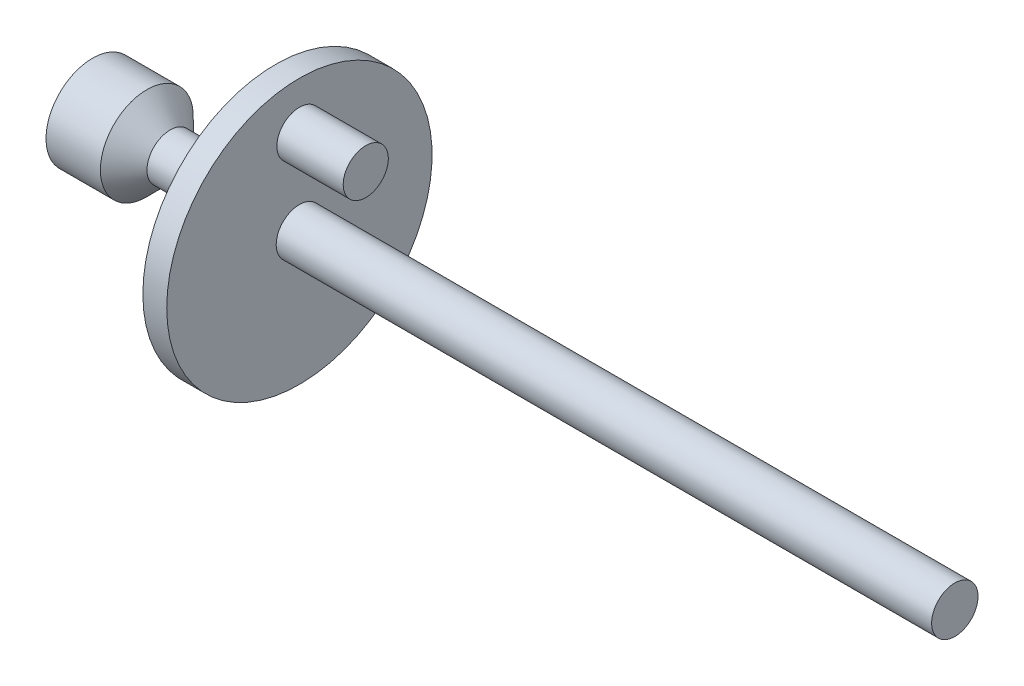
ISO-10303-21;
HEADER;
FILE_DESCRIPTION(('STEP AP214'),'2;1');
FILE_NAME('part.step','',(''),(''),'','','');
FILE_SCHEMA(('AUTOMOTIVE_DESIGN { 1 0 10303 214 1 1 1 1 }'));
ENDSEC;
DATA;
#1=APPLICATION_CONTEXT('core data for automotive mechanical design processes');
#2=APPLICATION_PROTOCOL_DEFINITION('international standard','automotive_design',2000,#1);
#3=PRODUCT_CONTEXT('',#1,'mechanical');
#4=PRODUCT('Part','Part','',(#3));
#5=PRODUCT_RELATED_PRODUCT_CATEGORY('part','',(#4));
#6=PRODUCT_DEFINITION_FORMATION('','',#4);
#7=PRODUCT_DEFINITION_CONTEXT('part definition',#1,'design');
#8=PRODUCT_DEFINITION('design','',#6,#7);
#9=PRODUCT_DEFINITION_SHAPE('','',#8);
#10=(LENGTH_UNIT() NAMED_UNIT(*) SI_UNIT(.MILLI.,.METRE.));
#11=(NAMED_UNIT(*) PLANE_ANGLE_UNIT() SI_UNIT($,.RADIAN.));
#12=(NAMED_UNIT(*) SI_UNIT($,.STERADIAN.) SOLID_ANGLE_UNIT());
#13=UNCERTAINTY_MEASURE_WITH_UNIT(LENGTH_MEASURE(1.E-05),#10,'distance_accuracy_value','');
#14=(GEOMETRIC_REPRESENTATION_CONTEXT(3) GLOBAL_UNCERTAINTY_ASSIGNED_CONTEXT((#13)) GLOBAL_UNIT_ASSIGNED_CONTEXT((#10,
#11,#12)) REPRESENTATION_CONTEXT('',''));
#15=CARTESIAN_POINT('',(0.,0.,0.));
#16=DIRECTION('',(0.,0.,1.));
#17=DIRECTION('',(1.,0.,0.));
#18=AXIS2_PLACEMENT_3D('',#15,#16,#17);
#19=CARTESIAN_POINT('',(650.,0.,0.));
#20=DIRECTION('',(-1.,0.,0.));
#21=DIRECTION('',(0.,0.,1.));
#22=AXIS2_PLACEMENT_3D('',#19,#20,#21);
#23=PLANE('',#22);
#24=CARTESIAN_POINT('',(650.,0.,0.));
#25=DIRECTION('',(-1.,0.,0.));
#26=DIRECTION('',(0.,0.,1.));
#27=AXIS2_PLACEMENT_3D('',#24,#25,#26);
#28=CIRCLE('',#27,17.5);
#29=CARTESIAN_POINT('',(650.,0.,17.5));
#30=VERTEX_POINT('',#29);
#31=EDGE_CURVE('E46',#30,#30,#28,.T.);
#32=ORIENTED_EDGE('',*,*,#31,.F.);
#33=EDGE_LOOP('',(#32));
#34=FACE_BOUND('',#33,.T.);
#35=ADVANCED_FACE('F39',(#34),#23,.F.);
#36=CARTESIAN_POINT('',(0.,0.,0.));
#37=DIRECTION('',(-1.,0.,0.));
#38=DIRECTION('',(0.,0.,1.));
#39=AXIS2_PLACEMENT_3D('',#36,#37,#38);
#40=CYLINDRICAL_SURFACE('',#39,17.5);
#41=CARTESIAN_POINT('',(156.,0.,0.));
#42=DIRECTION('',(-1.,0.,0.));
#43=DIRECTION('',(0.,0.,1.));
#44=AXIS2_PLACEMENT_3D('',#41,#42,#43);
#45=CIRCLE('',#44,17.4999999999999);
#46=CARTESIAN_POINT('',(156.,0.,17.4999999999999));
#47=VERTEX_POINT('',#46);
#48=EDGE_CURVE('E133',#47,#47,#45,.T.);
#49=ORIENTED_EDGE('',*,*,#48,.F.);
#50=EDGE_LOOP('',(#49));
#51=FACE_BOUND('',#50,.T.);
#52=ORIENTED_EDGE('',*,*,#31,.T.);
#53=EDGE_LOOP('',(#52));
#54=FACE_BOUND('',#53,.T.);
#55=ADVANCED_FACE('F138',(#51,#54),#40,.T.);
#56=CARTESIAN_POINT('',(156.,17.4999999999999,0.));
#57=DIRECTION('',(-1.,0.,0.));
#58=DIRECTION('',(0.,0.,1.));
#59=AXIS2_PLACEMENT_3D('',#56,#57,#58);
#60=PLANE('',#59);
#61=CARTESIAN_POINT('',(156.,64.,0.));
#62=DIRECTION('',(-1.,0.,0.));
#63=DIRECTION('',(0.,0.,1.));
#64=AXIS2_PLACEMENT_3D('',#61,#62,#63);
#65=CIRCLE('',#64,17.);
#66=CARTESIAN_POINT('',(156.,64.,17.));
#67=VERTEX_POINT('',#66);
#68=EDGE_CURVE('E11',#67,#67,#65,.F.);
#69=ORIENTED_EDGE('',*,*,#68,.F.);
#70=EDGE_LOOP('',(#69));
#71=FACE_BOUND('',#70,.T.);
#72=CARTESIAN_POINT('',(156.,0.,0.));
#73=DIRECTION('',(-1.,0.,0.));
#74=DIRECTION('',(0.,0.,1.));
#75=AXIS2_PLACEMENT_3D('',#72,#73,#74);
#76=CIRCLE('',#75,100.);
#77=CARTESIAN_POINT('',(156.,0.,100.));
#78=VERTEX_POINT('',#77);
#79=EDGE_CURVE('E130',#78,#78,#76,.T.);
#80=ORIENTED_EDGE('',*,*,#79,.F.);
#81=EDGE_LOOP('',(#80));
#82=FACE_BOUND('',#81,.T.);
#83=ORIENTED_EDGE('',*,*,#48,.T.);
#84=EDGE_LOOP('',(#83));
#85=FACE_BOUND('',#84,.T.);
#86=ADVANCED_FACE('F144',(#71,#82,#85),#60,.F.);
#87=CARTESIAN_POINT('',(0.,0.,0.));
#88=DIRECTION('',(-1.,0.,0.));
#89=DIRECTION('',(0.,0.,1.));
#90=AXIS2_PLACEMENT_3D('',#87,#88,#89);
#91=CYLINDRICAL_SURFACE('',#90,100.);
#92=CARTESIAN_POINT('',(138.,0.,0.));
#93=DIRECTION('',(-1.,0.,0.));
#94=DIRECTION('',(0.,0.,1.));
#95=AXIS2_PLACEMENT_3D('',#92,#93,#94);
#96=CIRCLE('',#95,100.);
#97=CARTESIAN_POINT('',(138.,0.,100.));
#98=VERTEX_POINT('',#97);
#99=EDGE_CURVE('E127',#98,#98,#96,.T.);
#100=ORIENTED_EDGE('',*,*,#99,.F.);
#101=EDGE_LOOP('',(#100));
#102=FACE_BOUND('',#101,.T.);
#103=ORIENTED_EDGE('',*,*,#79,.T.);
#104=EDGE_LOOP('',(#103));
#105=FACE_BOUND('',#104,.T.);
#106=ADVANCED_FACE('F150',(#102,#105),#91,.T.);
#107=CARTESIAN_POINT('',(138.,100.,0.));
#108=DIRECTION('',(1.,0.,0.));
#109=DIRECTION('',(0.,0.,-1.));
#110=AXIS2_PLACEMENT_3D('',#107,#108,#109);
#111=PLANE('',#110);
#112=CARTESIAN_POINT('',(138.,0.,0.));
#113=DIRECTION('',(-1.,0.,0.));
#114=DIRECTION('',(0.,0.,1.));
#115=AXIS2_PLACEMENT_3D('',#112,#113,#114);
#116=CIRCLE('',#115,17.4999999999999);
#117=CARTESIAN_POINT('',(138.,0.,17.4999999999999));
#118=VERTEX_POINT('',#117);
#119=EDGE_CURVE('E124',#118,#118,#116,.T.);
#120=ORIENTED_EDGE('',*,*,#119,.F.);
#121=EDGE_LOOP('',(#120));
#122=FACE_BOUND('',#121,.T.);
#123=ORIENTED_EDGE('',*,*,#99,.T.);
#124=EDGE_LOOP('',(#123));
#125=FACE_BOUND('',#124,.T.);
#126=ADVANCED_FACE('F157',(#122,#125),#111,.F.);
#127=CARTESIAN_POINT('',(0.,0.,0.));
#128=DIRECTION('',(-1.,0.,0.));
#129=DIRECTION('',(0.,0.,1.));
#130=AXIS2_PLACEMENT_3D('',#127,#128,#129);
#131=CYLINDRICAL_SURFACE('',#130,17.4999999999999);
#132=CARTESIAN_POINT('',(58.6,0.,0.));
#133=DIRECTION('',(-1.,0.,0.));
#134=DIRECTION('',(0.,0.,1.));
#135=AXIS2_PLACEMENT_3D('',#132,#133,#134);
#136=CIRCLE('',#135,17.4999999999999);
#137=CARTESIAN_POINT('',(58.6,0.,17.4999999999999));
#138=VERTEX_POINT('',#137);
#139=EDGE_CURVE('E121',#138,#138,#136,.T.);
#140=ORIENTED_EDGE('',*,*,#139,.F.);
#141=EDGE_LOOP('',(#140));
#142=FACE_BOUND('',#141,.T.);
#143=ORIENTED_EDGE('',*,*,#119,.T.);
#144=EDGE_LOOP('',(#143));
#145=FACE_BOUND('',#144,.T.);
#146=ADVANCED_FACE('F161',(#142,#145),#131,.T.);
#147=CARTESIAN_POINT('',(58.6,0.,0.));
#148=DIRECTION('',(-1.,0.,0.));
#149=DIRECTION('',(0.,0.,1.));
#150=AXIS2_PLACEMENT_3D('',#147,#148,#149);
#151=CONICAL_SURFACE('',#150,17.4999999999999,0.782549168256689);
#152=CARTESIAN_POINT('',(41.,0.,0.));
#153=DIRECTION('',(-1.,0.,0.));
#154=DIRECTION('',(0.,0.,1.));
#155=AXIS2_PLACEMENT_3D('',#152,#153,#154);
#156=CIRCLE('',#155,35.);
#157=CARTESIAN_POINT('',(41.,0.,35.));
#158=VERTEX_POINT('',#157);
#159=EDGE_CURVE('E118',#158,#158,#156,.T.);
#160=ORIENTED_EDGE('',*,*,#159,.F.);
#161=EDGE_LOOP('',(#160));
#162=FACE_BOUND('',#161,.T.);
#163=ORIENTED_EDGE('',*,*,#139,.T.);
#164=EDGE_LOOP('',(#163));
#165=FACE_BOUND('',#164,.T.);
#166=ADVANCED_FACE('F165',(#162,#165),#151,.T.);
#167=CARTESIAN_POINT('',(0.,0.,0.));
#168=DIRECTION('',(-1.,0.,0.));
#169=DIRECTION('',(0.,0.,1.));
#170=AXIS2_PLACEMENT_3D('',#167,#168,#169);
#171=CYLINDRICAL_SURFACE('',#170,35.);
#172=CARTESIAN_POINT('',(0.,0.,0.));
#173=DIRECTION('',(-1.,0.,0.));
#174=DIRECTION('',(0.,0.,1.));
#175=AXIS2_PLACEMENT_3D('',#172,#173,#174);
#176=CIRCLE('',#175,35.);
#177=CARTESIAN_POINT('',(0.,0.,35.));
#178=VERTEX_POINT('',#177);
#179=EDGE_CURVE('E115',#178,#178,#176,.T.);
#180=ORIENTED_EDGE('',*,*,#179,.F.);
#181=EDGE_LOOP('',(#180));
#182=FACE_BOUND('',#181,.T.);
#183=ORIENTED_EDGE('',*,*,#159,.T.);
#184=EDGE_LOOP('',(#183));
#185=FACE_BOUND('',#184,.T.);
#186=ADVANCED_FACE('F169',(#182,#185),#171,.T.);
#187=CARTESIAN_POINT('',(0.,35.,0.));
#188=DIRECTION('',(1.,0.,0.));
#189=DIRECTION('',(0.,0.,-1.));
#190=AXIS2_PLACEMENT_3D('',#187,#188,#189);
#191=PLANE('',#190);
#192=DIRECTION('',(0.,0.,1.));
#193=VECTOR('',#192,1.);
#194=CARTESIAN_POINT('',(0.,-20.,-20.));
#195=LINE('',#194,#193);
#196=CARTESIAN_POINT('',(0.,-20.,-20.));
#197=VERTEX_POINT('',#196);
#198=CARTESIAN_POINT('',(0.,-20.,20.));
#199=VERTEX_POINT('',#198);
#200=EDGE_CURVE('E97',#197,#199,#195,.T.);
#201=ORIENTED_EDGE('',*,*,#200,.F.);
#202=DIRECTION('',(0.,-1.,0.));
#203=VECTOR('',#202,1.);
#204=CARTESIAN_POINT('',(0.,20.,-20.));
#205=LINE('',#204,#203);
#206=CARTESIAN_POINT('',(0.,20.,-20.));
#207=VERTEX_POINT('',#206);
#208=EDGE_CURVE('E53',#207,#197,#205,.T.);
#209=ORIENTED_EDGE('',*,*,#208,.F.);
#210=DIRECTION('',(0.,0.,-1.));
#211=VECTOR('',#210,1.);
#212=CARTESIAN_POINT('',(0.,20.,-20.));
#213=LINE('',#212,#211);
#214=CARTESIAN_POINT('',(0.,20.,20.));
#215=VERTEX_POINT('',#214);
#216=EDGE_CURVE('E83',#215,#207,#213,.T.);
#217=ORIENTED_EDGE('',*,*,#216,.F.);
#218=DIRECTION('',(0.,1.,0.));
#219=VECTOR('',#218,1.);
#220=CARTESIAN_POINT('',(0.,20.,20.));
#221=LINE('',#220,#219);
#222=EDGE_CURVE('E91',#199,#215,#221,.T.);
#223=ORIENTED_EDGE('',*,*,#222,.F.);
#224=EDGE_LOOP('',(#201,#209,#217,#223));
#225=FACE_BOUND('',#224,.T.);
#226=ORIENTED_EDGE('',*,*,#179,.T.);
#227=EDGE_LOOP('',(#226));
#228=FACE_BOUND('',#227,.T.);
#229=ADVANCED_FACE('F99',(#225,#228),#191,.F.);
#230=CARTESIAN_POINT('',(206.,81.,0.));
#231=DIRECTION('',(-1.,0.,0.));
#232=DIRECTION('',(0.,0.,1.));
#233=AXIS2_PLACEMENT_3D('',#230,#231,#232);
#234=PLANE('',#233);
#235=CARTESIAN_POINT('',(206.,64.,0.));
#236=DIRECTION('',(-1.,0.,0.));
#237=DIRECTION('',(0.,0.,1.));
#238=AXIS2_PLACEMENT_3D('',#235,#236,#237);
#239=CIRCLE('',#238,17.);
#240=CARTESIAN_POINT('',(206.,64.,17.));
#241=VERTEX_POINT('',#240);
#242=EDGE_CURVE('E108',#241,#241,#239,.T.);
#243=ORIENTED_EDGE('',*,*,#242,.F.);
#244=EDGE_LOOP('',(#243));
#245=FACE_BOUND('',#244,.T.);
#246=ADVANCED_FACE('F176',(#245),#234,.F.);
#247=CARTESIAN_POINT('',(156.,64.,0.));
#248=DIRECTION('',(-1.,0.,0.));
#249=DIRECTION('',(0.,0.,1.));
#250=AXIS2_PLACEMENT_3D('',#247,#248,#249);
#251=CYLINDRICAL_SURFACE('',#250,17.);
#252=ORIENTED_EDGE('',*,*,#68,.T.);
#253=EDGE_LOOP('',(#252));
#254=FACE_BOUND('',#253,.T.);
#255=ORIENTED_EDGE('',*,*,#242,.T.);
#256=EDGE_LOOP('',(#255));
#257=FACE_BOUND('',#256,.T.);
#258=ADVANCED_FACE('F179',(#254,#257),#251,.T.);
#259=CARTESIAN_POINT('',(25.,20.,-20.));
#260=DIRECTION('',(0.,0.,-1.));
#261=DIRECTION('',(0.,1.,0.));
#262=AXIS2_PLACEMENT_3D('',#259,#260,#261);
#263=PLANE('',#262);
#264=ORIENTED_EDGE('',*,*,#208,.T.);
#265=DIRECTION('',(-1.,0.,0.));
#266=VECTOR('',#265,1.);
#267=CARTESIAN_POINT('',(25.,-20.,-20.));
#268=LINE('',#267,#266);
#269=CARTESIAN_POINT('',(25.,-20.,-20.));
#270=VERTEX_POINT('',#269);
#271=EDGE_CURVE('E111',#270,#197,#268,.T.);
#272=ORIENTED_EDGE('',*,*,#271,.F.);
#273=DIRECTION('',(0.,-1.,0.));
#274=VECTOR('',#273,1.);
#275=CARTESIAN_POINT('',(25.,20.,-20.));
#276=LINE('',#275,#274);
#277=CARTESIAN_POINT('',(25.,20.,-20.));
#278=VERTEX_POINT('',#277);
#279=EDGE_CURVE('E101',#278,#270,#276,.T.);
#280=ORIENTED_EDGE('',*,*,#279,.F.);
#281=DIRECTION('',(-1.,0.,0.));
#282=VECTOR('',#281,1.);
#283=CARTESIAN_POINT('',(25.,20.,-20.));
#284=LINE('',#283,#282);
#285=EDGE_CURVE('E87',#278,#207,#284,.T.);
#286=ORIENTED_EDGE('',*,*,#285,.T.);
#287=EDGE_LOOP('',(#264,#272,#280,#286));
#288=FACE_BOUND('',#287,.T.);
#289=ADVANCED_FACE('F183',(#288),#263,.F.);
#290=CARTESIAN_POINT('',(25.,20.,-20.));
#291=DIRECTION('',(0.,1.,0.));
#292=DIRECTION('',(0.,0.,1.));
#293=AXIS2_PLACEMENT_3D('',#290,#291,#292);
#294=PLANE('',#293);
#295=ORIENTED_EDGE('',*,*,#216,.T.);
#296=ORIENTED_EDGE('',*,*,#285,.F.);
#297=DIRECTION('',(0.,0.,-1.));
#298=VECTOR('',#297,1.);
#299=CARTESIAN_POINT('',(25.,20.,-20.));
#300=LINE('',#299,#298);
#301=CARTESIAN_POINT('',(25.,20.,20.));
#302=VERTEX_POINT('',#301);
#303=EDGE_CURVE('E85',#302,#278,#300,.T.);
#304=ORIENTED_EDGE('',*,*,#303,.F.);
#305=DIRECTION('',(-1.,0.,0.));
#306=VECTOR('',#305,1.);
#307=CARTESIAN_POINT('',(25.,20.,20.));
#308=LINE('',#307,#306);
#309=EDGE_CURVE('E78',#302,#215,#308,.T.);
#310=ORIENTED_EDGE('',*,*,#309,.T.);
#311=EDGE_LOOP('',(#295,#296,#304,#310));
#312=FACE_BOUND('',#311,.T.);
#313=ADVANCED_FACE('F80',(#312),#294,.F.);
#314=CARTESIAN_POINT('',(25.,20.,20.));
#315=DIRECTION('',(0.,0.,1.));
#316=DIRECTION('',(0.,-1.,0.));
#317=AXIS2_PLACEMENT_3D('',#314,#315,#316);
#318=PLANE('',#317);
#319=ORIENTED_EDGE('',*,*,#222,.T.);
#320=ORIENTED_EDGE('',*,*,#309,.F.);
#321=DIRECTION('',(0.,1.,0.));
#322=VECTOR('',#321,1.);
#323=CARTESIAN_POINT('',(25.,20.,20.));
#324=LINE('',#323,#322);
#325=CARTESIAN_POINT('',(25.,-20.,20.));
#326=VERTEX_POINT('',#325);
#327=EDGE_CURVE('E62',#326,#302,#324,.T.);
#328=ORIENTED_EDGE('',*,*,#327,.F.);
#329=DIRECTION('',(-1.,0.,0.));
#330=VECTOR('',#329,1.);
#331=CARTESIAN_POINT('',(25.,-20.,20.));
#332=LINE('',#331,#330);
#333=EDGE_CURVE('E88',#326,#199,#332,.T.);
#334=ORIENTED_EDGE('',*,*,#333,.T.);
#335=EDGE_LOOP('',(#319,#320,#328,#334));
#336=FACE_BOUND('',#335,.T.);
#337=ADVANCED_FACE('F92',(#336),#318,.F.);
#338=CARTESIAN_POINT('',(25.,-20.,-20.));
#339=DIRECTION('',(0.,-1.,0.));
#340=DIRECTION('',(0.,0.,-1.));
#341=AXIS2_PLACEMENT_3D('',#338,#339,#340);
#342=PLANE('',#341);
#343=ORIENTED_EDGE('',*,*,#200,.T.);
#344=ORIENTED_EDGE('',*,*,#333,.F.);
#345=DIRECTION('',(0.,0.,1.));
#346=VECTOR('',#345,1.);
#347=CARTESIAN_POINT('',(25.,-20.,-20.));
#348=LINE('',#347,#346);
#349=EDGE_CURVE('E104',#270,#326,#348,.T.);
#350=ORIENTED_EDGE('',*,*,#349,.F.);
#351=ORIENTED_EDGE('',*,*,#271,.T.);
#352=EDGE_LOOP('',(#343,#344,#350,#351));
#353=FACE_BOUND('',#352,.T.);
#354=ADVANCED_FACE('F187',(#353),#342,.F.);
#355=CARTESIAN_POINT('',(25.,0.,-20.));
#356=DIRECTION('',(0.342020143325669,0.,-0.939692620785908));
#357=DIRECTION('',(-0.939692620785909,0.,-0.342020143325669));
#358=AXIS2_PLACEMENT_3D('',#355,#356,#357);
#359=PLANE('',#358);
#360=ORIENTED_EDGE('',*,*,#279,.T.);
#361=DIRECTION('',(-0.889126490715988,-0.323615577118185,-0.323615577118185));
#362=VECTOR('',#361,1.);
#363=CARTESIAN_POINT('',(30.7547036484824,-17.9054591649293,-17.9054591649293));
#364=LINE('',#363,#362);
#365=CARTESIAN_POINT('',(50.,-10.9007441433449,-10.9007441433449));
#366=VERTEX_POINT('',#365);
#367=EDGE_CURVE('E237',#366,#270,#364,.T.);
#368=ORIENTED_EDGE('',*,*,#367,.F.);
#369=DIRECTION('',(0.,-1.,0.));
#370=VECTOR('',#369,1.);
#371=CARTESIAN_POINT('',(50.,0.,-10.9007441433449));
#372=LINE('',#371,#370);
#373=CARTESIAN_POINT('',(50.,10.9007441433449,-10.9007441433449));
#374=VERTEX_POINT('',#373);
#375=EDGE_CURVE('E219',#374,#366,#372,.T.);
#376=ORIENTED_EDGE('',*,*,#375,.F.);
#377=DIRECTION('',(-0.889126490715988,0.323615577118185,-0.323615577118185));
#378=VECTOR('',#377,1.);
#379=CARTESIAN_POINT('',(30.7547036484824,17.9054591649293,-17.9054591649293));
#380=LINE('',#379,#378);
#381=EDGE_CURVE('E243',#374,#278,#380,.T.);
#382=ORIENTED_EDGE('',*,*,#381,.T.);
#383=EDGE_LOOP('',(#360,#368,#376,#382));
#384=FACE_BOUND('',#383,.T.);
#385=ADVANCED_FACE('F190',(#384),#359,.F.);
#386=CARTESIAN_POINT('',(25.,20.,0.));
#387=DIRECTION('',(0.342020143325669,0.939692620785908,0.));
#388=DIRECTION('',(-0.939692620785909,0.342020143325669,0.));
#389=AXIS2_PLACEMENT_3D('',#386,#387,#388);
#390=PLANE('',#389);
#391=ORIENTED_EDGE('',*,*,#303,.T.);
#392=ORIENTED_EDGE('',*,*,#381,.F.);
#393=DIRECTION('',(0.,0.,-1.));
#394=VECTOR('',#393,1.);
#395=CARTESIAN_POINT('',(50.,10.9007441433449,0.));
#396=LINE('',#395,#394);
#397=CARTESIAN_POINT('',(50.,10.9007441433449,10.9007441433449));
#398=VERTEX_POINT('',#397);
#399=EDGE_CURVE('E225',#398,#374,#396,.T.);
#400=ORIENTED_EDGE('',*,*,#399,.F.);
#401=DIRECTION('',(-0.889126490715988,0.323615577118185,0.323615577118185));
#402=VECTOR('',#401,1.);
#403=CARTESIAN_POINT('',(30.7547036484824,17.9054591649293,17.9054591649293));
#404=LINE('',#403,#402);
#405=EDGE_CURVE('E234',#398,#302,#404,.T.);
#406=ORIENTED_EDGE('',*,*,#405,.T.);
#407=EDGE_LOOP('',(#391,#392,#400,#406));
#408=FACE_BOUND('',#407,.T.);
#409=ADVANCED_FACE('F196',(#408),#390,.F.);
#410=CARTESIAN_POINT('',(25.,0.,20.));
#411=DIRECTION('',(0.342020143325669,0.,0.939692620785908));
#412=DIRECTION('',(0.939692620785909,0.,-0.342020143325669));
#413=AXIS2_PLACEMENT_3D('',#410,#411,#412);
#414=PLANE('',#413);
#415=ORIENTED_EDGE('',*,*,#327,.T.);
#416=ORIENTED_EDGE('',*,*,#405,.F.);
#417=DIRECTION('',(0.,1.,0.));
#418=VECTOR('',#417,1.);
#419=CARTESIAN_POINT('',(50.,0.,10.9007441433449));
#420=LINE('',#419,#418);
#421=CARTESIAN_POINT('',(50.,-10.9007441433449,10.9007441433449));
#422=VERTEX_POINT('',#421);
#423=EDGE_CURVE('E230',#422,#398,#420,.T.);
#424=ORIENTED_EDGE('',*,*,#423,.F.);
#425=DIRECTION('',(-0.889126490715988,-0.323615577118185,0.323615577118185));
#426=VECTOR('',#425,1.);
#427=CARTESIAN_POINT('',(30.7547036484824,-17.9054591649293,17.9054591649293));
#428=LINE('',#427,#426);
#429=EDGE_CURVE('E257',#422,#326,#428,.T.);
#430=ORIENTED_EDGE('',*,*,#429,.T.);
#431=EDGE_LOOP('',(#415,#416,#424,#430));
#432=FACE_BOUND('',#431,.T.);
#433=ADVANCED_FACE('F199',(#432),#414,.F.);
#434=CARTESIAN_POINT('',(25.,-20.,0.));
#435=DIRECTION('',(0.342020143325669,-0.939692620785908,0.));
#436=DIRECTION('',(0.939692620785909,0.342020143325669,0.));
#437=AXIS2_PLACEMENT_3D('',#434,#435,#436);
#438=PLANE('',#437);
#439=ORIENTED_EDGE('',*,*,#349,.T.);
#440=ORIENTED_EDGE('',*,*,#429,.F.);
#441=DIRECTION('',(0.,0.,1.));
#442=VECTOR('',#441,1.);
#443=CARTESIAN_POINT('',(50.,-10.9007441433449,0.));
#444=LINE('',#443,#442);
#445=EDGE_CURVE('E223',#366,#422,#444,.T.);
#446=ORIENTED_EDGE('',*,*,#445,.F.);
#447=ORIENTED_EDGE('',*,*,#367,.T.);
#448=EDGE_LOOP('',(#439,#440,#446,#447));
#449=FACE_BOUND('',#448,.T.);
#450=ADVANCED_FACE('F203',(#449),#438,.F.);
#451=CARTESIAN_POINT('',(50.,0.,0.));
#452=DIRECTION('',(-1.,0.,0.));
#453=DIRECTION('',(0.,0.,1.));
#454=AXIS2_PLACEMENT_3D('',#451,#452,#453);
#455=PLANE('',#454);
#456=ORIENTED_EDGE('',*,*,#375,.T.);
#457=ORIENTED_EDGE('',*,*,#445,.T.);
#458=ORIENTED_EDGE('',*,*,#423,.T.);
#459=ORIENTED_EDGE('',*,*,#399,.T.);
#460=EDGE_LOOP('',(#456,#457,#458,#459));
#461=FACE_BOUND('',#460,.T.);
#462=ADVANCED_FACE('F206',(#461),#455,.T.);
#463=CLOSED_SHELL('',(#35,#55,#86,#106,#126,#146,#166,#186,#229,#246,#258,#289,#313,#337,#354,
#385,#409,#433,#450,#462));
#464=MANIFOLD_SOLID_BREP('B2',#463);
#465=ADVANCED_BREP_SHAPE_REPRESENTATION('',(#18,#464),#14);
#466=SHAPE_DEFINITION_REPRESENTATION(#9,#465);
ENDSEC;
END-ISO-10303-21;
